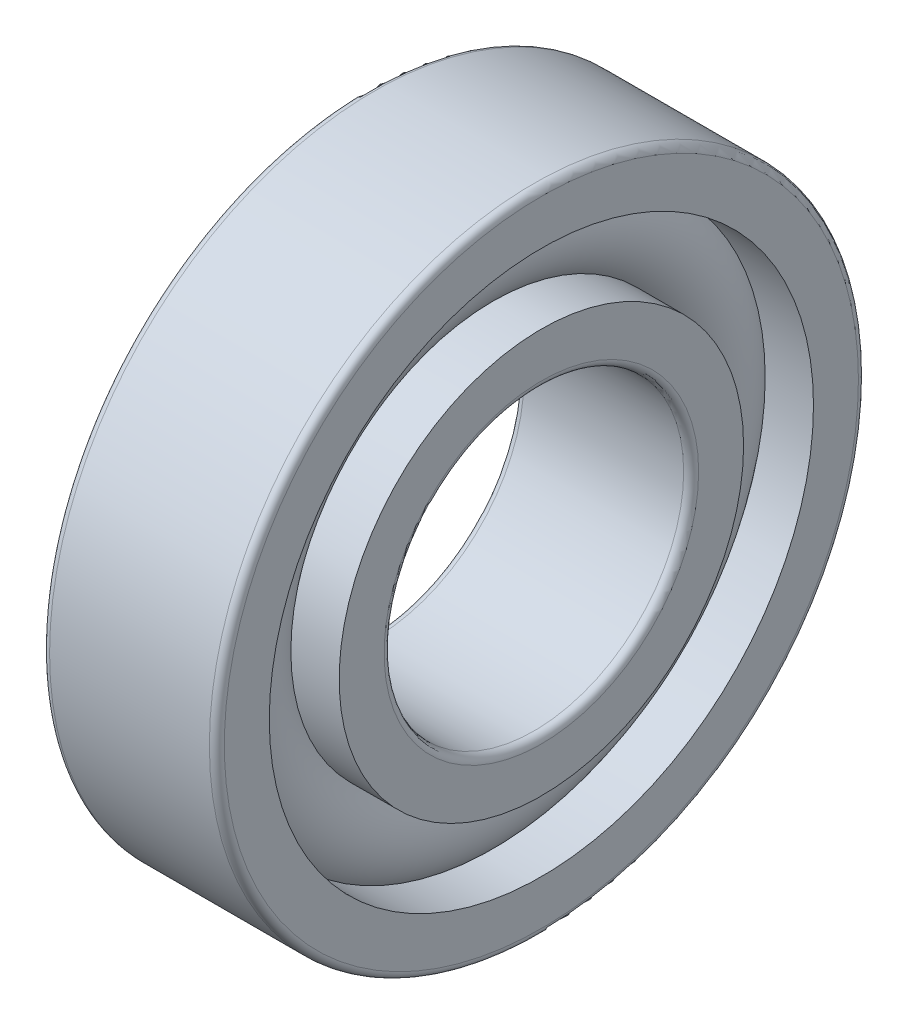
ISO-10303-21;
HEADER;
FILE_DESCRIPTION(('STEP AP214'),'2;1');
FILE_NAME('part.step','',(''),(''),'','','');
FILE_SCHEMA(('AUTOMOTIVE_DESIGN { 1 0 10303 214 1 1 1 1 }'));
ENDSEC;
DATA;
#1=APPLICATION_CONTEXT('core data for automotive mechanical design processes');
#2=APPLICATION_PROTOCOL_DEFINITION('international standard','automotive_design',2000,#1);
#3=PRODUCT_CONTEXT('',#1,'mechanical');
#4=PRODUCT('Part','Part','',(#3));
#5=PRODUCT_RELATED_PRODUCT_CATEGORY('part','',(#4));
#6=PRODUCT_DEFINITION_FORMATION('','',#4);
#7=PRODUCT_DEFINITION_CONTEXT('part definition',#1,'design');
#8=PRODUCT_DEFINITION('design','',#6,#7);
#9=PRODUCT_DEFINITION_SHAPE('','',#8);
#10=(LENGTH_UNIT() NAMED_UNIT(*) SI_UNIT(.MILLI.,.METRE.));
#11=(NAMED_UNIT(*) PLANE_ANGLE_UNIT() SI_UNIT($,.RADIAN.));
#12=(NAMED_UNIT(*) SI_UNIT($,.STERADIAN.) SOLID_ANGLE_UNIT());
#13=UNCERTAINTY_MEASURE_WITH_UNIT(LENGTH_MEASURE(1.E-05),#10,'distance_accuracy_value','');
#14=(GEOMETRIC_REPRESENTATION_CONTEXT(3) GLOBAL_UNCERTAINTY_ASSIGNED_CONTEXT((#13)) GLOBAL_UNIT_ASSIGNED_CONTEXT((#10,
#11,#12)) REPRESENTATION_CONTEXT('',''));
#15=CARTESIAN_POINT('',(0.,0.,0.));
#16=DIRECTION('',(0.,0.,1.));
#17=DIRECTION('',(1.,0.,0.));
#18=AXIS2_PLACEMENT_3D('',#15,#16,#17);
#19=CARTESIAN_POINT('',(0.,0.,0.));
#20=DIRECTION('',(-1.,0.,0.));
#21=DIRECTION('',(0.,0.,1.));
#22=AXIS2_PLACEMENT_3D('',#19,#20,#21);
#23=TOROIDAL_SURFACE('',#22,4.75,1.05);
#24=CARTESIAN_POINT('',(0.782623792124922,0.,0.));
#25=DIRECTION('',(-1.,0.,0.));
#26=DIRECTION('',(0.,0.,1.));
#27=AXIS2_PLACEMENT_3D('',#24,#25,#26);
#28=CIRCLE('',#27,5.45000000000001);
#29=CARTESIAN_POINT('',(0.782623792124922,0.,5.45000000000001));
#30=VERTEX_POINT('',#29);
#31=EDGE_CURVE('E41',#30,#30,#28,.F.);
#32=ORIENTED_EDGE('',*,*,#31,.T.);
#33=EDGE_LOOP('',(#32));
#34=FACE_BOUND('',#33,.T.);
#35=CARTESIAN_POINT('',(0.782623792124925,0.,0.));
#36=DIRECTION('',(-1.,0.,0.));
#37=DIRECTION('',(0.,0.,1.));
#38=AXIS2_PLACEMENT_3D('',#35,#36,#37);
#39=CIRCLE('',#38,4.05);
#40=CARTESIAN_POINT('',(0.782623792124925,0.,4.05));
#41=VERTEX_POINT('',#40);
#42=EDGE_CURVE('E10',#41,#41,#39,.T.);
#43=ORIENTED_EDGE('',*,*,#42,.T.);
#44=EDGE_LOOP('',(#43));
#45=FACE_BOUND('',#44,.T.);
#46=ADVANCED_FACE('F37',(#34,#45),#23,.T.);
#47=CARTESIAN_POINT('',(-20.6375,0.,0.));
#48=DIRECTION('',(1.,0.,0.));
#49=DIRECTION('',(0.,0.,-1.));
#50=AXIS2_PLACEMENT_3D('',#47,#48,#49);
#51=CYLINDRICAL_SURFACE('',#50,4.05);
#52=CARTESIAN_POINT('',(1.75,0.,0.));
#53=DIRECTION('',(1.,0.,0.));
#54=DIRECTION('',(0.,0.,-1.));
#55=AXIS2_PLACEMENT_3D('',#52,#53,#54);
#56=CIRCLE('',#55,4.05);
#57=CARTESIAN_POINT('',(1.75,0.,-4.05));
#58=VERTEX_POINT('',#57);
#59=EDGE_CURVE('E50',#58,#58,#56,.T.);
#60=ORIENTED_EDGE('',*,*,#59,.F.);
#61=EDGE_LOOP('',(#60));
#62=FACE_BOUND('',#61,.T.);
#63=ORIENTED_EDGE('',*,*,#42,.F.);
#64=EDGE_LOOP('',(#63));
#65=FACE_BOUND('',#64,.T.);
#66=ADVANCED_FACE('F89',(#62,#65),#51,.T.);
#67=CARTESIAN_POINT('',(-20.6375,0.,0.));
#68=DIRECTION('',(1.,0.,0.));
#69=DIRECTION('',(0.,0.,-1.));
#70=AXIS2_PLACEMENT_3D('',#67,#68,#69);
#71=CYLINDRICAL_SURFACE('',#70,4.05);
#72=CARTESIAN_POINT('',(-1.75,0.,0.));
#73=DIRECTION('',(1.,0.,0.));
#74=DIRECTION('',(0.,0.,-1.));
#75=AXIS2_PLACEMENT_3D('',#72,#73,#74);
#76=CIRCLE('',#75,4.05);
#77=CARTESIAN_POINT('',(-1.75,0.,-4.05));
#78=VERTEX_POINT('',#77);
#79=EDGE_CURVE('E59',#78,#78,#76,.T.);
#80=ORIENTED_EDGE('',*,*,#79,.T.);
#81=EDGE_LOOP('',(#80));
#82=FACE_BOUND('',#81,.T.);
#83=CARTESIAN_POINT('',(-0.782623792124925,0.,0.));
#84=DIRECTION('',(1.,0.,0.));
#85=DIRECTION('',(0.,0.,-1.));
#86=AXIS2_PLACEMENT_3D('',#83,#84,#85);
#87=CIRCLE('',#86,4.05);
#88=CARTESIAN_POINT('',(-0.782623792124925,0.,-4.05));
#89=VERTEX_POINT('',#88);
#90=EDGE_CURVE('E45',#89,#89,#87,.T.);
#91=ORIENTED_EDGE('',*,*,#90,.F.);
#92=EDGE_LOOP('',(#91));
#93=FACE_BOUND('',#92,.T.);
#94=ADVANCED_FACE('F92',(#82,#93),#71,.T.);
#95=CARTESIAN_POINT('',(1.75,3.15,0.));
#96=DIRECTION('',(1.,0.,0.));
#97=DIRECTION('',(0.,0.,-1.));
#98=AXIS2_PLACEMENT_3D('',#95,#96,#97);
#99=PLANE('',#98);
#100=ORIENTED_EDGE('',*,*,#59,.T.);
#101=EDGE_LOOP('',(#100));
#102=FACE_BOUND('',#101,.T.);
#103=CARTESIAN_POINT('',(1.75,0.,0.));
#104=DIRECTION('',(1.,0.,0.));
#105=DIRECTION('',(0.,0.,-1.));
#106=AXIS2_PLACEMENT_3D('',#103,#104,#105);
#107=CIRCLE('',#106,3.15);
#108=CARTESIAN_POINT('',(1.75,0.,-3.15));
#109=VERTEX_POINT('',#108);
#110=EDGE_CURVE('E81',#109,#109,#107,.T.);
#111=ORIENTED_EDGE('',*,*,#110,.F.);
#112=EDGE_LOOP('',(#111));
#113=FACE_BOUND('',#112,.T.);
#114=ADVANCED_FACE('F86',(#102,#113),#99,.T.);
#115=CARTESIAN_POINT('',(1.6,0.,0.));
#116=DIRECTION('',(1.,0.,0.));
#117=DIRECTION('',(0.,0.,-1.));
#118=AXIS2_PLACEMENT_3D('',#115,#116,#117);
#119=TOROIDAL_SURFACE('',#118,3.15,0.15);
#120=ORIENTED_EDGE('',*,*,#110,.T.);
#121=EDGE_LOOP('',(#120));
#122=FACE_BOUND('',#121,.T.);
#123=CARTESIAN_POINT('',(1.6,0.,0.));
#124=DIRECTION('',(1.,0.,0.));
#125=DIRECTION('',(0.,0.,-1.));
#126=AXIS2_PLACEMENT_3D('',#123,#124,#125);
#127=CIRCLE('',#126,3.);
#128=CARTESIAN_POINT('',(1.6,0.,-3.));
#129=VERTEX_POINT('',#128);
#130=EDGE_CURVE('E78',#129,#129,#127,.T.);
#131=ORIENTED_EDGE('',*,*,#130,.F.);
#132=EDGE_LOOP('',(#131));
#133=FACE_BOUND('',#132,.T.);
#134=ADVANCED_FACE('F103',(#122,#133),#119,.T.);
#135=CARTESIAN_POINT('',(-20.6375,0.,0.));
#136=DIRECTION('',(1.,0.,0.));
#137=DIRECTION('',(0.,0.,-1.));
#138=AXIS2_PLACEMENT_3D('',#135,#136,#137);
#139=CYLINDRICAL_SURFACE('',#138,3.);
#140=ORIENTED_EDGE('',*,*,#130,.T.);
#141=EDGE_LOOP('',(#140));
#142=FACE_BOUND('',#141,.T.);
#143=CARTESIAN_POINT('',(-1.6,0.,0.));
#144=DIRECTION('',(1.,0.,0.));
#145=DIRECTION('',(0.,0.,-1.));
#146=AXIS2_PLACEMENT_3D('',#143,#144,#145);
#147=CIRCLE('',#146,3.);
#148=CARTESIAN_POINT('',(-1.6,0.,-3.));
#149=VERTEX_POINT('',#148);
#150=EDGE_CURVE('E75',#149,#149,#147,.T.);
#151=ORIENTED_EDGE('',*,*,#150,.F.);
#152=EDGE_LOOP('',(#151));
#153=FACE_BOUND('',#152,.T.);
#154=ADVANCED_FACE('F106',(#142,#153),#139,.F.);
#155=CARTESIAN_POINT('',(-1.6,0.,0.));
#156=DIRECTION('',(1.,0.,0.));
#157=DIRECTION('',(0.,0.,-1.));
#158=AXIS2_PLACEMENT_3D('',#155,#156,#157);
#159=TOROIDAL_SURFACE('',#158,3.15,0.15);
#160=ORIENTED_EDGE('',*,*,#150,.T.);
#161=EDGE_LOOP('',(#160));
#162=FACE_BOUND('',#161,.T.);
#163=CARTESIAN_POINT('',(-1.75,0.,0.));
#164=DIRECTION('',(1.,0.,0.));
#165=DIRECTION('',(0.,0.,-1.));
#166=AXIS2_PLACEMENT_3D('',#163,#164,#165);
#167=CIRCLE('',#166,3.15);
#168=CARTESIAN_POINT('',(-1.75,0.,-3.15));
#169=VERTEX_POINT('',#168);
#170=EDGE_CURVE('E72',#169,#169,#167,.T.);
#171=ORIENTED_EDGE('',*,*,#170,.F.);
#172=EDGE_LOOP('',(#171));
#173=FACE_BOUND('',#172,.T.);
#174=ADVANCED_FACE('F110',(#162,#173),#159,.T.);
#175=CARTESIAN_POINT('',(-1.75,4.05,0.));
#176=DIRECTION('',(-1.,0.,0.));
#177=DIRECTION('',(0.,0.,1.));
#178=AXIS2_PLACEMENT_3D('',#175,#176,#177);
#179=PLANE('',#178);
#180=ORIENTED_EDGE('',*,*,#170,.T.);
#181=EDGE_LOOP('',(#180));
#182=FACE_BOUND('',#181,.T.);
#183=ORIENTED_EDGE('',*,*,#79,.F.);
#184=EDGE_LOOP('',(#183));
#185=FACE_BOUND('',#184,.T.);
#186=ADVANCED_FACE('F114',(#182,#185),#179,.T.);
#187=CARTESIAN_POINT('',(-0.782623792124922,0.,0.));
#188=DIRECTION('',(1.,0.,0.));
#189=DIRECTION('',(0.,0.,-1.));
#190=AXIS2_PLACEMENT_3D('',#187,#188,#189);
#191=CIRCLE('',#190,5.45000000000001);
#192=CARTESIAN_POINT('',(-0.782623792124922,0.,-5.45000000000001));
#193=VERTEX_POINT('',#192);
#194=EDGE_CURVE('E53',#193,#193,#191,.F.);
#195=ORIENTED_EDGE('',*,*,#194,.T.);
#196=EDGE_LOOP('',(#195));
#197=FACE_BOUND('',#196,.T.);
#198=ORIENTED_EDGE('',*,*,#90,.T.);
#199=EDGE_LOOP('',(#198));
#200=FACE_BOUND('',#199,.T.);
#201=ADVANCED_FACE('F39',(#197,#200),#23,.T.);
#202=CARTESIAN_POINT('',(-20.6375,0.,0.));
#203=DIRECTION('',(1.,0.,0.));
#204=DIRECTION('',(0.,0.,-1.));
#205=AXIS2_PLACEMENT_3D('',#202,#203,#204);
#206=CYLINDRICAL_SURFACE('',#205,5.45000000000001);
#207=CARTESIAN_POINT('',(1.75,0.,0.));
#208=DIRECTION('',(1.,0.,0.));
#209=DIRECTION('',(0.,0.,-1.));
#210=AXIS2_PLACEMENT_3D('',#207,#208,#209);
#211=CIRCLE('',#210,5.45000000000001);
#212=CARTESIAN_POINT('',(1.75,0.,-5.45000000000001));
#213=VERTEX_POINT('',#212);
#214=EDGE_CURVE('E55',#213,#213,#211,.T.);
#215=ORIENTED_EDGE('',*,*,#214,.T.);
#216=EDGE_LOOP('',(#215));
#217=FACE_BOUND('',#216,.T.);
#218=ORIENTED_EDGE('',*,*,#31,.F.);
#219=EDGE_LOOP('',(#218));
#220=FACE_BOUND('',#219,.T.);
#221=ADVANCED_FACE('F119',(#217,#220),#206,.F.);
#222=CARTESIAN_POINT('',(-20.6375,0.,0.));
#223=DIRECTION('',(1.,0.,0.));
#224=DIRECTION('',(0.,0.,-1.));
#225=AXIS2_PLACEMENT_3D('',#222,#223,#224);
#226=CYLINDRICAL_SURFACE('',#225,5.45000000000001);
#227=CARTESIAN_POINT('',(-1.75,0.,0.));
#228=DIRECTION('',(1.,0.,0.));
#229=DIRECTION('',(0.,0.,-1.));
#230=AXIS2_PLACEMENT_3D('',#227,#228,#229);
#231=CIRCLE('',#230,5.45000000000001);
#232=CARTESIAN_POINT('',(-1.75,0.,-5.45000000000001));
#233=VERTEX_POINT('',#232);
#234=EDGE_CURVE('E150',#233,#233,#231,.T.);
#235=ORIENTED_EDGE('',*,*,#234,.F.);
#236=EDGE_LOOP('',(#235));
#237=FACE_BOUND('',#236,.T.);
#238=ORIENTED_EDGE('',*,*,#194,.F.);
#239=EDGE_LOOP('',(#238));
#240=FACE_BOUND('',#239,.T.);
#241=ADVANCED_FACE('F122',(#237,#240),#226,.F.);
#242=CARTESIAN_POINT('',(1.75,6.35,0.));
#243=DIRECTION('',(1.,0.,0.));
#244=DIRECTION('',(0.,0.,-1.));
#245=AXIS2_PLACEMENT_3D('',#242,#243,#244);
#246=PLANE('',#245);
#247=CARTESIAN_POINT('',(1.75,0.,0.));
#248=DIRECTION('',(1.,0.,0.));
#249=DIRECTION('',(0.,0.,-1.));
#250=AXIS2_PLACEMENT_3D('',#247,#248,#249);
#251=CIRCLE('',#250,6.35);
#252=CARTESIAN_POINT('',(1.75,0.,-6.35));
#253=VERTEX_POINT('',#252);
#254=EDGE_CURVE('E61',#253,#253,#251,.T.);
#255=ORIENTED_EDGE('',*,*,#254,.T.);
#256=EDGE_LOOP('',(#255));
#257=FACE_BOUND('',#256,.T.);
#258=ORIENTED_EDGE('',*,*,#214,.F.);
#259=EDGE_LOOP('',(#258));
#260=FACE_BOUND('',#259,.T.);
#261=ADVANCED_FACE('F123',(#257,#260),#246,.T.);
#262=CARTESIAN_POINT('',(1.6,0.,0.));
#263=DIRECTION('',(1.,0.,0.));
#264=DIRECTION('',(0.,0.,-1.));
#265=AXIS2_PLACEMENT_3D('',#262,#263,#264);
#266=TOROIDAL_SURFACE('',#265,6.35,0.15);
#267=CARTESIAN_POINT('',(1.6,0.,0.));
#268=DIRECTION('',(1.,0.,0.));
#269=DIRECTION('',(0.,0.,-1.));
#270=AXIS2_PLACEMENT_3D('',#267,#268,#269);
#271=CIRCLE('',#270,6.50000000000001);
#272=CARTESIAN_POINT('',(1.6,0.,-6.50000000000001));
#273=VERTEX_POINT('',#272);
#274=EDGE_CURVE('E66',#273,#273,#271,.T.);
#275=ORIENTED_EDGE('',*,*,#274,.T.);
#276=EDGE_LOOP('',(#275));
#277=FACE_BOUND('',#276,.T.);
#278=ORIENTED_EDGE('',*,*,#254,.F.);
#279=EDGE_LOOP('',(#278));
#280=FACE_BOUND('',#279,.T.);
#281=ADVANCED_FACE('F126',(#277,#280),#266,.T.);
#282=CARTESIAN_POINT('',(-20.6375,0.,0.));
#283=DIRECTION('',(1.,0.,0.));
#284=DIRECTION('',(0.,0.,-1.));
#285=AXIS2_PLACEMENT_3D('',#282,#283,#284);
#286=CYLINDRICAL_SURFACE('',#285,6.50000000000001);
#287=CARTESIAN_POINT('',(-1.6,0.,0.));
#288=DIRECTION('',(1.,0.,0.));
#289=DIRECTION('',(0.,0.,-1.));
#290=AXIS2_PLACEMENT_3D('',#287,#288,#289);
#291=CIRCLE('',#290,6.50000000000001);
#292=CARTESIAN_POINT('',(-1.6,0.,-6.50000000000001));
#293=VERTEX_POINT('',#292);
#294=EDGE_CURVE('E154',#293,#293,#291,.T.);
#295=ORIENTED_EDGE('',*,*,#294,.T.);
#296=EDGE_LOOP('',(#295));
#297=FACE_BOUND('',#296,.T.);
#298=ORIENTED_EDGE('',*,*,#274,.F.);
#299=EDGE_LOOP('',(#298));
#300=FACE_BOUND('',#299,.T.);
#301=ADVANCED_FACE('F130',(#297,#300),#286,.T.);
#302=CARTESIAN_POINT('',(-1.6,0.,0.));
#303=DIRECTION('',(1.,0.,0.));
#304=DIRECTION('',(0.,0.,-1.));
#305=AXIS2_PLACEMENT_3D('',#302,#303,#304);
#306=TOROIDAL_SURFACE('',#305,6.35,0.15);
#307=CARTESIAN_POINT('',(-1.75,0.,0.));
#308=DIRECTION('',(1.,0.,0.));
#309=DIRECTION('',(0.,0.,-1.));
#310=AXIS2_PLACEMENT_3D('',#307,#308,#309);
#311=CIRCLE('',#310,6.35);
#312=CARTESIAN_POINT('',(-1.75,0.,-6.35));
#313=VERTEX_POINT('',#312);
#314=EDGE_CURVE('E151',#313,#313,#311,.T.);
#315=ORIENTED_EDGE('',*,*,#314,.T.);
#316=EDGE_LOOP('',(#315));
#317=FACE_BOUND('',#316,.T.);
#318=ORIENTED_EDGE('',*,*,#294,.F.);
#319=EDGE_LOOP('',(#318));
#320=FACE_BOUND('',#319,.T.);
#321=ADVANCED_FACE('F134',(#317,#320),#306,.T.);
#322=CARTESIAN_POINT('',(-1.75,5.45000000000001,0.));
#323=DIRECTION('',(-1.,0.,0.));
#324=DIRECTION('',(0.,0.,1.));
#325=AXIS2_PLACEMENT_3D('',#322,#323,#324);
#326=PLANE('',#325);
#327=ORIENTED_EDGE('',*,*,#234,.T.);
#328=EDGE_LOOP('',(#327));
#329=FACE_BOUND('',#328,.T.);
#330=ORIENTED_EDGE('',*,*,#314,.F.);
#331=EDGE_LOOP('',(#330));
#332=FACE_BOUND('',#331,.T.);
#333=ADVANCED_FACE('F138',(#329,#332),#326,.T.);
#334=CLOSED_SHELL('',(#46,#66,#94,#114,#134,#154,#174,#186,#201,#221,#241,#261,#281,#301,#321,#333));
#335=MANIFOLD_SOLID_BREP('B2',#334);
#336=ADVANCED_BREP_SHAPE_REPRESENTATION('',(#18,#335),#14);
#337=SHAPE_DEFINITION_REPRESENTATION(#9,#336);
ENDSEC;
END-ISO-10303-21;
